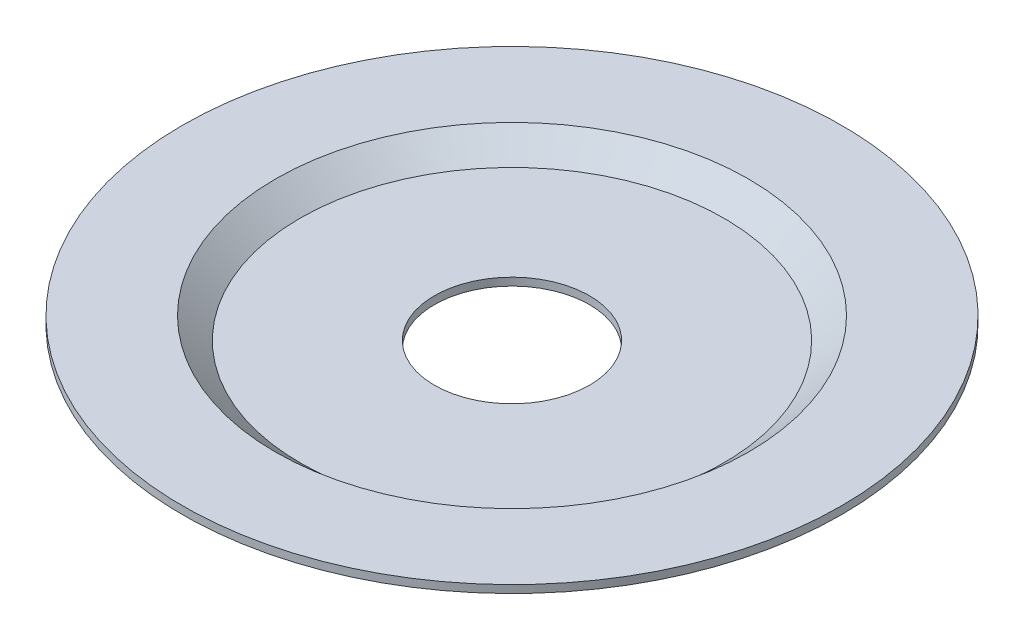
ISO-10303-21;
HEADER;
FILE_DESCRIPTION(('STEP AP214'),'2;1');
FILE_NAME('part.step','',(''),(''),'','','');
FILE_SCHEMA(('AUTOMOTIVE_DESIGN { 1 0 10303 214 1 1 1 1 }'));
ENDSEC;
DATA;
#1=APPLICATION_CONTEXT('core data for automotive mechanical design processes');
#2=APPLICATION_PROTOCOL_DEFINITION('international standard','automotive_design',2000,#1);
#3=PRODUCT_CONTEXT('',#1,'mechanical');
#4=PRODUCT('Part','Part','',(#3));
#5=PRODUCT_RELATED_PRODUCT_CATEGORY('part','',(#4));
#6=PRODUCT_DEFINITION_FORMATION('','',#4);
#7=PRODUCT_DEFINITION_CONTEXT('part definition',#1,'design');
#8=PRODUCT_DEFINITION('design','',#6,#7);
#9=PRODUCT_DEFINITION_SHAPE('','',#8);
#10=(LENGTH_UNIT() NAMED_UNIT(*) SI_UNIT(.MILLI.,.METRE.));
#11=(NAMED_UNIT(*) PLANE_ANGLE_UNIT() SI_UNIT($,.RADIAN.));
#12=(NAMED_UNIT(*) SI_UNIT($,.STERADIAN.) SOLID_ANGLE_UNIT());
#13=UNCERTAINTY_MEASURE_WITH_UNIT(LENGTH_MEASURE(1.E-05),#10,'distance_accuracy_value','');
#14=(GEOMETRIC_REPRESENTATION_CONTEXT(3) GLOBAL_UNCERTAINTY_ASSIGNED_CONTEXT((#13)) GLOBAL_UNIT_ASSIGNED_CONTEXT((#10,
#11,#12)) REPRESENTATION_CONTEXT('',''));
#15=CARTESIAN_POINT('',(0.,0.,0.));
#16=DIRECTION('',(0.,0.,1.));
#17=DIRECTION('',(1.,0.,0.));
#18=AXIS2_PLACEMENT_3D('',#15,#16,#17);
#19=CARTESIAN_POINT('',(0.0119315118099895,0.,0.));
#20=DIRECTION('',(0.,1.,0.));
#21=DIRECTION('',(-1.,0.,0.));
#22=AXIS2_PLACEMENT_3D('',#19,#20,#21);
#23=CONICAL_SURFACE('',#22,61.,0.850469332631083);
#24=CARTESIAN_POINT('',(0.0119315118099885,-5.57584598914342,0.));
#25=DIRECTION('',(0.,1.,0.));
#26=DIRECTION('',(-1.,0.,0.));
#27=AXIS2_PLACEMENT_3D('',#24,#25,#26);
#28=CIRCLE('',#27,54.6468209513318);
#29=CARTESIAN_POINT('',(-54.6348894395218,-5.57584598914341,0.));
#30=VERTEX_POINT('',#29);
#31=EDGE_CURVE('E10',#30,#30,#28,.T.);
#32=ORIENTED_EDGE('',*,*,#31,.F.);
#33=EDGE_LOOP('',(#32));
#34=FACE_BOUND('',#33,.T.);
#35=CARTESIAN_POINT('',(0.0119315118099895,0.,0.));
#36=DIRECTION('',(0.,1.,0.));
#37=DIRECTION('',(-1.,0.,0.));
#38=AXIS2_PLACEMENT_3D('',#35,#36,#37);
#39=CIRCLE('',#38,61.);
#40=CARTESIAN_POINT('',(-60.98806848819,0.,0.));
#41=VERTEX_POINT('',#40);
#42=EDGE_CURVE('E57',#41,#41,#39,.T.);
#43=ORIENTED_EDGE('',*,*,#42,.T.);
#44=EDGE_LOOP('',(#43));
#45=FACE_BOUND('',#44,.T.);
#46=ADVANCED_FACE('F35',(#34,#45),#23,.F.);
#47=CARTESIAN_POINT('',(54.6587524631418,-5.57584598914343,0.));
#48=DIRECTION('',(0.,-1.,0.));
#49=DIRECTION('',(1.,0.,0.));
#50=AXIS2_PLACEMENT_3D('',#47,#48,#49);
#51=PLANE('',#50);
#52=CARTESIAN_POINT('',(0.,-5.57584598914342,0.));
#53=DIRECTION('',(0.,-1.,0.));
#54=DIRECTION('',(1.,0.,0.));
#55=AXIS2_PLACEMENT_3D('',#52,#53,#54);
#56=CIRCLE('',#55,20.);
#57=CARTESIAN_POINT('',(20.,-5.57584598914343,0.));
#58=VERTEX_POINT('',#57);
#59=EDGE_CURVE('E60',#58,#58,#56,.T.);
#60=ORIENTED_EDGE('',*,*,#59,.T.);
#61=EDGE_LOOP('',(#60));
#62=FACE_BOUND('',#61,.T.);
#63=ORIENTED_EDGE('',*,*,#31,.T.);
#64=EDGE_LOOP('',(#63));
#65=FACE_BOUND('',#64,.T.);
#66=ADVANCED_FACE('F74',(#62,#65),#51,.F.);
#67=CARTESIAN_POINT('',(0.0119315118099881,-7.5758459891434,0.));
#68=DIRECTION('',(0.,1.,0.));
#69=DIRECTION('',(-1.,0.,0.));
#70=AXIS2_PLACEMENT_3D('',#67,#68,#69);
#71=PLANE('',#70);
#72=CARTESIAN_POINT('',(0.,-7.5758459891434,0.));
#73=DIRECTION('',(0.,-1.,0.));
#74=DIRECTION('',(1.,0.,0.));
#75=AXIS2_PLACEMENT_3D('',#72,#73,#74);
#76=CIRCLE('',#75,20.);
#77=CARTESIAN_POINT('',(20.,-7.57584598914341,0.));
#78=VERTEX_POINT('',#77);
#79=EDGE_CURVE('E63',#78,#78,#76,.T.);
#80=ORIENTED_EDGE('',*,*,#79,.F.);
#81=EDGE_LOOP('',(#80));
#82=FACE_BOUND('',#81,.T.);
#83=CARTESIAN_POINT('',(0.0119315118099881,-7.5758459891434,0.));
#84=DIRECTION('',(0.,1.,0.));
#85=DIRECTION('',(-1.,0.,0.));
#86=AXIS2_PLACEMENT_3D('',#83,#84,#85);
#87=CIRCLE('',#86,55.4);
#88=CARTESIAN_POINT('',(-55.38806848819,-7.57584598914339,0.));
#89=VERTEX_POINT('',#88);
#90=EDGE_CURVE('E41',#89,#89,#87,.T.);
#91=ORIENTED_EDGE('',*,*,#90,.F.);
#92=EDGE_LOOP('',(#91));
#93=FACE_BOUND('',#92,.T.);
#94=ADVANCED_FACE('F70',(#82,#93),#71,.F.);
#95=CARTESIAN_POINT('',(0.0119315118099881,-7.5758459891434,0.));
#96=DIRECTION('',(0.,1.,0.));
#97=DIRECTION('',(-1.,0.,0.));
#98=AXIS2_PLACEMENT_3D('',#95,#96,#97);
#99=CONICAL_SURFACE('',#98,55.4,0.850469332631083);
#100=CARTESIAN_POINT('',(0.0119315118099891,-1.99999999999997,0.));
#101=DIRECTION('',(0.,1.,0.));
#102=DIRECTION('',(-1.,0.,0.));
#103=AXIS2_PLACEMENT_3D('',#100,#101,#102);
#104=CIRCLE('',#103,61.7531790486682);
#105=CARTESIAN_POINT('',(-61.7412475368582,-1.99999999999996,0.));
#106=VERTEX_POINT('',#105);
#107=EDGE_CURVE('E45',#106,#106,#104,.T.);
#108=ORIENTED_EDGE('',*,*,#107,.F.);
#109=EDGE_LOOP('',(#108));
#110=FACE_BOUND('',#109,.T.);
#111=ORIENTED_EDGE('',*,*,#90,.T.);
#112=EDGE_LOOP('',(#111));
#113=FACE_BOUND('',#112,.T.);
#114=ADVANCED_FACE('F73',(#110,#113),#99,.T.);
#115=CARTESIAN_POINT('',(61.7651105604782,-1.99999999999998,0.));
#116=DIRECTION('',(0.,1.,0.));
#117=DIRECTION('',(-1.,0.,0.));
#118=AXIS2_PLACEMENT_3D('',#115,#116,#117);
#119=PLANE('',#118);
#120=CARTESIAN_POINT('',(0.0119315118099891,-1.99999999999997,0.));
#121=DIRECTION('',(0.,1.,0.));
#122=DIRECTION('',(-1.,0.,0.));
#123=AXIS2_PLACEMENT_3D('',#120,#121,#122);
#124=CIRCLE('',#123,84.9880684881905);
#125=CARTESIAN_POINT('',(-84.9761369763805,-1.99999999999996,0.));
#126=VERTEX_POINT('',#125);
#127=EDGE_CURVE('E49',#126,#126,#124,.T.);
#128=ORIENTED_EDGE('',*,*,#127,.F.);
#129=EDGE_LOOP('',(#128));
#130=FACE_BOUND('',#129,.T.);
#131=ORIENTED_EDGE('',*,*,#107,.T.);
#132=EDGE_LOOP('',(#131));
#133=FACE_BOUND('',#132,.T.);
#134=ADVANCED_FACE('F80',(#130,#133),#119,.F.);
#135=CARTESIAN_POINT('',(0.0119315118100049,83.7696793026993,0.));
#136=DIRECTION('',(0.,1.,0.));
#137=DIRECTION('',(-1.,0.,0.));
#138=AXIS2_PLACEMENT_3D('',#135,#136,#137);
#139=CYLINDRICAL_SURFACE('',#138,84.9880684881905);
#140=CARTESIAN_POINT('',(0.0119315118099895,0.,0.));
#141=DIRECTION('',(0.,1.,0.));
#142=DIRECTION('',(-1.,0.,0.));
#143=AXIS2_PLACEMENT_3D('',#140,#141,#142);
#144=CIRCLE('',#143,84.9880684881905);
#145=CARTESIAN_POINT('',(-84.9761369763805,0.,0.));
#146=VERTEX_POINT('',#145);
#147=EDGE_CURVE('E54',#146,#146,#144,.T.);
#148=ORIENTED_EDGE('',*,*,#147,.F.);
#149=EDGE_LOOP('',(#148));
#150=FACE_BOUND('',#149,.T.);
#151=ORIENTED_EDGE('',*,*,#127,.T.);
#152=EDGE_LOOP('',(#151));
#153=FACE_BOUND('',#152,.T.);
#154=ADVANCED_FACE('F94',(#150,#153),#139,.T.);
#155=CARTESIAN_POINT('',(85.0000000000005,0.,0.));
#156=DIRECTION('',(0.,-1.,0.));
#157=DIRECTION('',(1.,0.,0.));
#158=AXIS2_PLACEMENT_3D('',#155,#156,#157);
#159=PLANE('',#158);
#160=ORIENTED_EDGE('',*,*,#42,.F.);
#161=EDGE_LOOP('',(#160));
#162=FACE_BOUND('',#161,.T.);
#163=ORIENTED_EDGE('',*,*,#147,.T.);
#164=EDGE_LOOP('',(#163));
#165=FACE_BOUND('',#164,.T.);
#166=ADVANCED_FACE('F91',(#162,#165),#159,.F.);
#167=CARTESIAN_POINT('',(0.,0.,0.));
#168=DIRECTION('',(0.,-1.,0.));
#169=DIRECTION('',(1.,0.,0.));
#170=AXIS2_PLACEMENT_3D('',#167,#168,#169);
#171=CYLINDRICAL_SURFACE('',#170,20.);
#172=CARTESIAN_POINT('',(20.,-7.57584598914341,0.));
#173=CARTESIAN_POINT('',(20.,-7.55501265581007,0.));
#174=CARTESIAN_POINT('',(20.,-7.53417932247674,0.));
#175=CARTESIAN_POINT('',(20.,-7.49251265581007,0.));
#176=CARTESIAN_POINT('',(20.,-7.47167932247674,0.));
#177=CARTESIAN_POINT('',(20.,-7.43001265581007,0.));
#178=CARTESIAN_POINT('',(20.,-7.40917932247674,0.));
#179=CARTESIAN_POINT('',(20.,-7.36751265581008,0.));
#180=CARTESIAN_POINT('',(20.,-7.34667932247674,0.));
#181=CARTESIAN_POINT('',(20.,-7.30501265581008,0.));
#182=CARTESIAN_POINT('',(20.,-7.28417932247674,0.));
#183=CARTESIAN_POINT('',(20.,-7.24251265581008,0.));
#184=CARTESIAN_POINT('',(20.,-7.22167932247674,0.));
#185=CARTESIAN_POINT('',(20.,-7.18001265581008,0.));
#186=CARTESIAN_POINT('',(20.,-7.15917932247674,0.));
#187=CARTESIAN_POINT('',(20.,-7.11751265581008,0.));
#188=CARTESIAN_POINT('',(20.,-7.09667932247674,0.));
#189=CARTESIAN_POINT('',(20.,-7.05501265581008,0.));
#190=CARTESIAN_POINT('',(20.,-7.03417932247674,0.));
#191=CARTESIAN_POINT('',(20.,-6.99251265581008,0.));
#192=CARTESIAN_POINT('',(20.,-6.97167932247675,0.));
#193=CARTESIAN_POINT('',(20.,-6.93001265581008,0.));
#194=CARTESIAN_POINT('',(20.,-6.90917932247675,0.));
#195=CARTESIAN_POINT('',(20.,-6.86751265581008,0.));
#196=CARTESIAN_POINT('',(20.,-6.84667932247675,0.));
#197=CARTESIAN_POINT('',(20.,-6.80501265581008,0.));
#198=CARTESIAN_POINT('',(20.,-6.78417932247675,0.));
#199=CARTESIAN_POINT('',(20.,-6.74251265581008,0.));
#200=CARTESIAN_POINT('',(20.,-6.72167932247675,0.));
#201=CARTESIAN_POINT('',(20.,-6.68001265581008,0.));
#202=CARTESIAN_POINT('',(20.,-6.65917932247675,0.));
#203=CARTESIAN_POINT('',(20.,-6.61751265581008,0.));
#204=CARTESIAN_POINT('',(20.,-6.59667932247675,0.));
#205=CARTESIAN_POINT('',(20.,-6.55501265581008,0.));
#206=CARTESIAN_POINT('',(20.,-6.53417932247675,0.));
#207=CARTESIAN_POINT('',(20.,-6.49251265581008,0.));
#208=CARTESIAN_POINT('',(20.,-6.47167932247675,0.));
#209=CARTESIAN_POINT('',(20.,-6.43001265581008,0.));
#210=CARTESIAN_POINT('',(20.,-6.40917932247675,0.));
#211=CARTESIAN_POINT('',(20.,-6.36751265581008,0.));
#212=CARTESIAN_POINT('',(20.,-6.34667932247675,0.));
#213=CARTESIAN_POINT('',(20.,-6.30501265581009,0.));
#214=CARTESIAN_POINT('',(20.,-6.28417932247675,0.));
#215=CARTESIAN_POINT('',(20.,-6.24251265581009,0.));
#216=CARTESIAN_POINT('',(20.,-6.22167932247675,0.));
#217=CARTESIAN_POINT('',(20.,-6.18001265581009,0.));
#218=CARTESIAN_POINT('',(20.,-6.15917932247675,0.));
#219=CARTESIAN_POINT('',(20.,-6.11751265581009,0.));
#220=CARTESIAN_POINT('',(20.,-6.09667932247675,0.));
#221=CARTESIAN_POINT('',(20.,-6.05501265581009,0.));
#222=CARTESIAN_POINT('',(20.,-6.03417932247675,0.));
#223=CARTESIAN_POINT('',(20.,-5.99251265581009,0.));
#224=CARTESIAN_POINT('',(20.,-5.97167932247676,0.));
#225=CARTESIAN_POINT('',(20.,-5.93001265581009,0.));
#226=CARTESIAN_POINT('',(20.,-5.90917932247676,0.));
#227=CARTESIAN_POINT('',(20.,-5.86751265581009,0.));
#228=CARTESIAN_POINT('',(20.,-5.84667932247676,0.));
#229=CARTESIAN_POINT('',(20.,-5.80501265581009,0.));
#230=CARTESIAN_POINT('',(20.,-5.78417932247676,0.));
#231=CARTESIAN_POINT('',(20.,-5.74251265581009,0.));
#232=CARTESIAN_POINT('',(20.,-5.72167932247676,0.));
#233=CARTESIAN_POINT('',(20.,-5.68001265581009,0.));
#234=CARTESIAN_POINT('',(20.,-5.65917932247676,0.));
#235=CARTESIAN_POINT('',(20.,-5.61751265581009,0.));
#236=CARTESIAN_POINT('',(20.,-5.59667932247676,0.));
#237=CARTESIAN_POINT('',(20.,-5.57584598914343,0.));
#238=B_SPLINE_CURVE_WITH_KNOTS('',3,(#172,#173,#174,#175,#176,#177,#178,#179,#180,#181,#182,
#183,#184,#185,#186,#187,#188,#189,#190,#191,#192,#193,#194,#195,#196,#197,#198,#199,#200,#201,
#202,#203,#204,#205,#206,#207,#208,#209,#210,#211,#212,#213,#214,#215,#216,#217,#218,#219,#220,
#221,#222,#223,#224,#225,#226,#227,#228,#229,#230,#231,#232,#233,#234,#235,#236,#237),
.UNSPECIFIED.,.F.,.F.,(4,2,2,2,2,2,2,2,2,2,2,2,2,2,2,2,2,2,2,2,2,2,2,2,2,2,2,2,2,2,2,2,4),(0.,
0.0624999999999992,0.124999999999998,0.187499999999998,0.249999999999998,0.312499999999997,
0.374999999999997,0.437499999999996,0.499999999999995,0.562499999999994,0.624999999999994,
0.687499999999994,0.749999999999993,0.812499999999992,0.874999999999992,0.937499999999991,
0.99999999999999,1.06249999999999,1.12499999999999,1.18749999999999,1.24999999999999,
1.31249999999999,1.37499999999999,1.43749999999999,1.49999999999999,1.56249999999998,
1.62499999999998,1.68749999999998,1.74999999999998,1.81249999999998,1.87499999999998,
1.93749999999998,1.99999999999998),.UNSPECIFIED.);
#239=EDGE_CURVE('BSEAM67',#78,#58,#238,.T.);
#240=ORIENTED_EDGE('',*,*,#79,.T.);
#241=ORIENTED_EDGE('',*,*,#59,.F.);
#242=ORIENTED_EDGE('',*,*,#239,.T.);
#243=ORIENTED_EDGE('',*,*,#239,.F.);
#244=EDGE_LOOP('',(#240,#242,#241,#243));
#245=FACE_BOUND('',#244,.T.);
#246=ADVANCED_FACE('F67',(#245),#171,.F.);
#247=CLOSED_SHELL('',(#46,#66,#94,#114,#134,#154,#166,#246));
#248=MANIFOLD_SOLID_BREP('B2',#247);
#249=ADVANCED_BREP_SHAPE_REPRESENTATION('',(#18,#248),#14);
#250=SHAPE_DEFINITION_REPRESENTATION(#9,#249);
ENDSEC;
END-ISO-10303-21;
